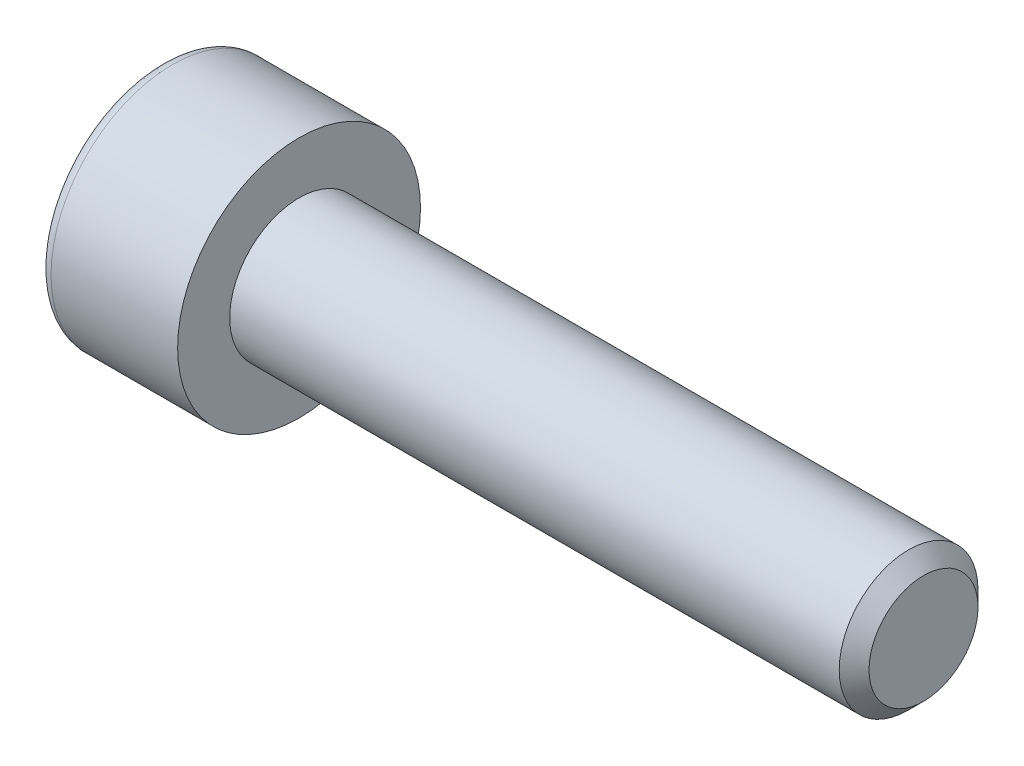
ISO-10303-21;
HEADER;
FILE_DESCRIPTION(('STEP AP214'),'2;1');
FILE_NAME('part.step','',(''),(''),'','','');
FILE_SCHEMA(('AUTOMOTIVE_DESIGN { 1 0 10303 214 1 1 1 1 }'));
ENDSEC;
DATA;
#1=APPLICATION_CONTEXT('core data for automotive mechanical design processes');
#2=APPLICATION_PROTOCOL_DEFINITION('international standard','automotive_design',2000,#1);
#3=PRODUCT_CONTEXT('',#1,'mechanical');
#4=PRODUCT('Part','Part','',(#3));
#5=PRODUCT_RELATED_PRODUCT_CATEGORY('part','',(#4));
#6=PRODUCT_DEFINITION_FORMATION('','',#4);
#7=PRODUCT_DEFINITION_CONTEXT('part definition',#1,'design');
#8=PRODUCT_DEFINITION('design','',#6,#7);
#9=PRODUCT_DEFINITION_SHAPE('','',#8);
#10=(LENGTH_UNIT() NAMED_UNIT(*) SI_UNIT(.MILLI.,.METRE.));
#11=(NAMED_UNIT(*) PLANE_ANGLE_UNIT() SI_UNIT($,.RADIAN.));
#12=(NAMED_UNIT(*) SI_UNIT($,.STERADIAN.) SOLID_ANGLE_UNIT());
#13=UNCERTAINTY_MEASURE_WITH_UNIT(LENGTH_MEASURE(1.E-05),#10,'distance_accuracy_value','');
#14=(GEOMETRIC_REPRESENTATION_CONTEXT(3) GLOBAL_UNCERTAINTY_ASSIGNED_CONTEXT((#13)) GLOBAL_UNIT_ASSIGNED_CONTEXT((#10,
#11,#12)) REPRESENTATION_CONTEXT('',''));
#15=CARTESIAN_POINT('',(0.,0.,0.));
#16=DIRECTION('',(0.,0.,1.));
#17=DIRECTION('',(1.,0.,0.));
#18=AXIS2_PLACEMENT_3D('',#15,#16,#17);
#19=CARTESIAN_POINT('',(18.,-1.60191,1.5705));
#20=DIRECTION('',(1.,0.,0.));
#21=DIRECTION('',(0.,0.,-1.));
#22=AXIS2_PLACEMENT_3D('',#19,#20,#21);
#23=PLANE('',#22);
#24=CARTESIAN_POINT('',(18.,0.,0.));
#25=DIRECTION('',(-1.,0.,0.));
#26=DIRECTION('',(0.,0.,1.));
#27=AXIS2_PLACEMENT_3D('',#24,#25,#26);
#28=CIRCLE('',#27,1.5705);
#29=CARTESIAN_POINT('',(18.,0.,1.5705));
#30=VERTEX_POINT('',#29);
#31=EDGE_CURVE('E20',#30,#30,#28,.T.);
#32=ORIENTED_EDGE('',*,*,#31,.F.);
#33=EDGE_LOOP('',(#32));
#34=FACE_BOUND('',#33,.T.);
#35=ADVANCED_FACE('F16',(#34),#23,.T.);
#36=CARTESIAN_POINT('',(-4.,0.,1.7320508075689));
#37=DIRECTION('',(0.,0.500000000000009,-0.866025403784433));
#38=DIRECTION('',(1.,0.,0.));
#39=AXIS2_PLACEMENT_3D('',#36,#37,#38);
#40=PLANE('',#39);
#41=DIRECTION('',(0.,0.866025403784433,0.500000000000009));
#42=VECTOR('',#41,1.);
#43=CARTESIAN_POINT('',(-4.,-0.749999999999999,1.29903810567667));
#44=LINE('',#43,#42);
#45=CARTESIAN_POINT('',(-4.,-1.5,0.86602540378444));
#46=VERTEX_POINT('',#45);
#47=CARTESIAN_POINT('',(-4.,0.,1.7320508075689));
#48=VERTEX_POINT('',#47);
#49=EDGE_CURVE('E68',#46,#48,#44,.T.);
#50=ORIENTED_EDGE('',*,*,#49,.T.);
#51=DIRECTION('',(-1.,0.,0.));
#52=VECTOR('',#51,1.);
#53=CARTESIAN_POINT('',(-2.675,0.,1.7320508075689));
#54=LINE('',#53,#52);
#55=CARTESIAN_POINT('',(-1.6,0.,1.7320508075689));
#56=VERTEX_POINT('',#55);
#57=EDGE_CURVE('E77',#56,#48,#54,.T.);
#58=ORIENTED_EDGE('',*,*,#57,.F.);
#59=CARTESIAN_POINT('',(-1.59999999999999,-1.50000000000001,0.866025403784436));
#60=CARTESIAN_POINT('',(-1.57802165884498,-1.43408408432772,0.90408197544171));
#61=CARTESIAN_POINT('',(-1.55803350782515,-1.3675991834091,0.942467050884126));
#62=CARTESIAN_POINT('',(-1.52314479055019,-1.23347823998543,1.01990181367375));
#63=CARTESIAN_POINT('',(-1.50825656525356,-1.16583981518653,1.05895287643896));
#64=CARTESIAN_POINT('',(-1.48508196920955,-1.03140117468085,1.1365710617244));
#65=CARTESIAN_POINT('',(-1.47664134069767,-0.964621638287686,1.17512624503735));
#66=CARTESIAN_POINT('',(-1.46656687609782,-0.830748509653515,1.25241793189155));
#67=CARTESIAN_POINT('',(-1.46492469548064,-0.763655403671048,1.2911541546913));
#68=CARTESIAN_POINT('',(-1.46834971761608,-0.638299132717716,1.36352863147081));
#69=CARTESIAN_POINT('',(-1.47257596391218,-0.580017157017145,1.39717774583044));
#70=CARTESIAN_POINT('',(-1.4859679755386,-0.463832893676476,1.46425676154578));
#71=CARTESIAN_POINT('',(-1.49513831107649,-0.405931007586783,1.49768643106625));
#72=CARTESIAN_POINT('',(-1.51806237500374,-0.289507393706606,1.56490363588));
#73=CARTESIAN_POINT('',(-1.53191323166373,-0.231000393462347,1.5986826682205));
#74=CARTESIAN_POINT('',(-1.56334882062951,-0.114858772496334,1.66573706434935));
#75=CARTESIAN_POINT('',(-1.58092617156416,-0.0572226650139558,1.69901328651934));
#76=CARTESIAN_POINT('',(-1.6,0.,1.7320508075689));
#77=B_SPLINE_CURVE_WITH_KNOTS('',3,(#59,#60,#61,#62,#63,#64,#65,#66,#67,#68,#69,#70,#71,#72,#73,
#74,#75,#76),.UNSPECIFIED.,.F.,.F.,(4,2,2,2,2,2,2,2,4),(0.,0.237762008667641,0.476095362770332,
0.708530704614692,0.940680666673367,1.14278083697393,1.34506814534581,1.55184121686651,
1.75820848013624),.UNSPECIFIED.);
#78=CARTESIAN_POINT('',(-1.59999999999999,-1.5,0.866025403784442));
#79=VERTEX_POINT('',#78);
#80=EDGE_CURVE('E63',#79,#56,#77,.T.);
#81=ORIENTED_EDGE('',*,*,#80,.F.);
#82=DIRECTION('',(1.,0.,0.));
#83=VECTOR('',#82,1.);
#84=CARTESIAN_POINT('',(-2.675,-1.5,0.86602540378444));
#85=LINE('',#84,#83);
#86=EDGE_CURVE('E99',#46,#79,#85,.T.);
#87=ORIENTED_EDGE('',*,*,#86,.F.);
#88=EDGE_LOOP('',(#50,#58,#81,#87));
#89=FACE_BOUND('',#88,.T.);
#90=ADVANCED_FACE('F78',(#89),#40,.T.);
#91=CARTESIAN_POINT('',(18.,0.,0.));
#92=DIRECTION('',(-1.,0.,0.));
#93=DIRECTION('',(0.,0.,1.));
#94=AXIS2_PLACEMENT_3D('',#91,#92,#93);
#95=CONICAL_SURFACE('',#94,1.5705,0.785398163397445);
#96=ORIENTED_EDGE('',*,*,#31,.T.);
#97=EDGE_LOOP('',(#96));
#98=FACE_BOUND('',#97,.T.);
#99=CARTESIAN_POINT('',(17.5705,0.,0.));
#100=DIRECTION('',(-1.,0.,0.));
#101=DIRECTION('',(0.,0.,1.));
#102=AXIS2_PLACEMENT_3D('',#99,#100,#101);
#103=CIRCLE('',#102,2.);
#104=CARTESIAN_POINT('',(17.5705,0.,2.));
#105=VERTEX_POINT('',#104);
#106=EDGE_CURVE('E95',#105,#105,#103,.T.);
#107=ORIENTED_EDGE('',*,*,#106,.F.);
#108=EDGE_LOOP('',(#107));
#109=FACE_BOUND('',#108,.T.);
#110=ADVANCED_FACE('F232',(#98,#109),#95,.T.);
#111=CARTESIAN_POINT('',(-4.,1.5,0.86602540378444));
#112=DIRECTION('',(0.,-0.500000000000009,-0.866025403784433));
#113=DIRECTION('',(1.,0.,0.));
#114=AXIS2_PLACEMENT_3D('',#111,#112,#113);
#115=PLANE('',#114);
#116=DIRECTION('',(0.,0.866025403784433,-0.500000000000009));
#117=VECTOR('',#116,1.);
#118=CARTESIAN_POINT('',(-4.,0.75,1.29903810567667));
#119=LINE('',#118,#117);
#120=CARTESIAN_POINT('',(-4.,1.5,0.86602540378444));
#121=VERTEX_POINT('',#120);
#122=EDGE_CURVE('E81',#48,#121,#119,.T.);
#123=ORIENTED_EDGE('',*,*,#122,.T.);
#124=DIRECTION('',(-1.,0.,0.));
#125=VECTOR('',#124,1.);
#126=CARTESIAN_POINT('',(-2.675,1.5,0.86602540378444));
#127=LINE('',#126,#125);
#128=CARTESIAN_POINT('',(-1.59999999999999,1.5,0.866025403784438));
#129=VERTEX_POINT('',#128);
#130=EDGE_CURVE('E92',#129,#121,#127,.T.);
#131=ORIENTED_EDGE('',*,*,#130,.F.);
#132=CARTESIAN_POINT('',(-1.6,0.,1.7320508075689));
#133=CARTESIAN_POINT('',(-1.57802165884499,0.0659159156722827,1.69399423591163));
#134=CARTESIAN_POINT('',(-1.55803350782516,0.132400816590911,1.65560916046921));
#135=CARTESIAN_POINT('',(-1.52314479055019,0.266521760014577,1.57817439767959));
#136=CARTESIAN_POINT('',(-1.50825656525356,0.334160184813478,1.53912333491438));
#137=CARTESIAN_POINT('',(-1.48508196920956,0.468598825319165,1.46150514962893));
#138=CARTESIAN_POINT('',(-1.47664134069767,0.535378361712325,1.42294996631598));
#139=CARTESIAN_POINT('',(-1.46656687609782,0.669251490346498,1.34565827946178));
#140=CARTESIAN_POINT('',(-1.46492469548064,0.736344596328965,1.30692205666204));
#141=CARTESIAN_POINT('',(-1.46834971761607,0.861700867282297,1.23454757988252));
#142=CARTESIAN_POINT('',(-1.47257596391217,0.919982842982867,1.20089846552289));
#143=CARTESIAN_POINT('',(-1.4859679755386,1.03616710632354,1.13381944980756));
#144=CARTESIAN_POINT('',(-1.49513831107648,1.09406899241323,1.10038978028709));
#145=CARTESIAN_POINT('',(-1.51806237500374,1.2104926062934,1.03317257547333));
#146=CARTESIAN_POINT('',(-1.53191323166372,1.26899960653766,0.999393543132834));
#147=CARTESIAN_POINT('',(-1.5633488206295,1.38514122750367,0.932339147003986));
#148=CARTESIAN_POINT('',(-1.58092617156415,1.44277733498605,0.899062924833992));
#149=CARTESIAN_POINT('',(-1.59999999999999,1.50000000000001,0.866025403784436));
#150=B_SPLINE_CURVE_WITH_KNOTS('',3,(#132,#133,#134,#135,#136,#137,#138,#139,#140,#141,#142,
#143,#144,#145,#146,#147,#148,#149),.UNSPECIFIED.,.F.,.F.,(4,2,2,2,2,2,2,2,4),(0.,
0.237762008667644,0.476095362770338,0.7085307046147,0.940680666673377,1.14278083697393,
1.34506814534582,1.55184121686652,1.75820848013624),.UNSPECIFIED.);
#151=EDGE_CURVE('E85',#56,#129,#150,.T.);
#152=ORIENTED_EDGE('',*,*,#151,.F.);
#153=ORIENTED_EDGE('',*,*,#57,.T.);
#154=EDGE_LOOP('',(#123,#131,#152,#153));
#155=FACE_BOUND('',#154,.T.);
#156=ADVANCED_FACE('F90',(#155),#115,.T.);
#157=CARTESIAN_POINT('',(-4.,-1.5,0.86602540378444));
#158=DIRECTION('',(0.,1.,0.));
#159=DIRECTION('',(1.,0.,0.));
#160=AXIS2_PLACEMENT_3D('',#157,#158,#159);
#161=PLANE('',#160);
#162=DIRECTION('',(0.,0.,1.));
#163=VECTOR('',#162,1.);
#164=CARTESIAN_POINT('',(-4.,-1.5,0.));
#165=LINE('',#164,#163);
#166=CARTESIAN_POINT('',(-4.,-1.5,-0.86602540378444));
#167=VERTEX_POINT('',#166);
#168=EDGE_CURVE('E201',#167,#46,#165,.T.);
#169=ORIENTED_EDGE('',*,*,#168,.T.);
#170=ORIENTED_EDGE('',*,*,#86,.T.);
#171=CARTESIAN_POINT('',(-1.59999999999999,-1.5,0.866025403784448));
#172=CARTESIAN_POINT('',(-1.57802165884498,-1.5,0.789912260469902));
#173=CARTESIAN_POINT('',(-1.55803350782515,-1.5,0.713142109585072));
#174=CARTESIAN_POINT('',(-1.52314479055019,-1.5,0.558272584005832));
#175=CARTESIAN_POINT('',(-1.50825656525356,-1.5,0.480170458475417));
#176=CARTESIAN_POINT('',(-1.48508196920955,-1.5,0.324934087904525));
#177=CARTESIAN_POINT('',(-1.47664134069766,-1.5,0.247823721278626));
#178=CARTESIAN_POINT('',(-1.46656687609782,-1.5,0.0932403475702334));
#179=CARTESIAN_POINT('',(-1.46492469548063,-1.5,0.015767901970742));
#180=CARTESIAN_POINT('',(-1.46834971761607,-1.5,-0.128981051588286));
#181=CARTESIAN_POINT('',(-1.47257596391217,-1.5,-0.196279280307542));
#182=CARTESIAN_POINT('',(-1.4859679755386,-1.5,-0.330437311738211));
#183=CARTESIAN_POINT('',(-1.49513831107648,-1.5,-0.397296650779154));
#184=CARTESIAN_POINT('',(-1.51806237500373,-1.5,-0.531731060406653));
#185=CARTESIAN_POINT('',(-1.53191323166372,-1.5,-0.599289125087655));
#186=CARTESIAN_POINT('',(-1.5633488206295,-1.5,-0.73339791734535));
#187=CARTESIAN_POINT('',(-1.58092617156415,-1.5,-0.799950361685337));
#188=CARTESIAN_POINT('',(-1.59999999999999,-1.5,-0.866025403784448));
#189=B_SPLINE_CURVE_WITH_KNOTS('',3,(#171,#172,#173,#174,#175,#176,#177,#178,#179,#180,#181,
#182,#183,#184,#185,#186,#187,#188),.UNSPECIFIED.,.F.,.F.,(4,2,2,2,2,2,2,2,4),(0.,
0.237762008667641,0.476095362770333,0.708530704614693,0.940680666673367,1.14278083697393,
1.34506814534581,1.55184121686651,1.75820848013624),.UNSPECIFIED.);
#190=CARTESIAN_POINT('',(-1.59999999999999,-1.5,-0.866025403784442));
#191=VERTEX_POINT('',#190);
#192=EDGE_CURVE('E88',#79,#191,#189,.T.);
#193=ORIENTED_EDGE('',*,*,#192,.T.);
#194=DIRECTION('',(1.,0.,0.));
#195=VECTOR('',#194,1.);
#196=CARTESIAN_POINT('',(-2.675,-1.5,-0.86602540378444));
#197=LINE('',#196,#195);
#198=EDGE_CURVE('E186',#167,#191,#197,.T.);
#199=ORIENTED_EDGE('',*,*,#198,.F.);
#200=EDGE_LOOP('',(#169,#170,#193,#199));
#201=FACE_BOUND('',#200,.T.);
#202=ADVANCED_FACE('F229',(#201),#161,.T.);
#203=CARTESIAN_POINT('',(0.,0.,0.));
#204=DIRECTION('',(1.,0.,0.));
#205=DIRECTION('',(0.,0.,-1.));
#206=AXIS2_PLACEMENT_3D('',#203,#204,#205);
#207=CYLINDRICAL_SURFACE('',#206,2.);
#208=CARTESIAN_POINT('',(0.,0.,0.));
#209=DIRECTION('',(1.,0.,0.));
#210=DIRECTION('',(0.,0.,-1.));
#211=AXIS2_PLACEMENT_3D('',#208,#209,#210);
#212=CIRCLE('',#211,2.);
#213=CARTESIAN_POINT('',(0.,0.,-2.));
#214=VERTEX_POINT('',#213);
#215=EDGE_CURVE('E148',#214,#214,#212,.F.);
#216=ORIENTED_EDGE('',*,*,#215,.F.);
#217=EDGE_LOOP('',(#216));
#218=FACE_BOUND('',#217,.T.);
#219=ORIENTED_EDGE('',*,*,#106,.T.);
#220=EDGE_LOOP('',(#219));
#221=FACE_BOUND('',#220,.T.);
#222=ADVANCED_FACE('F122',(#218,#221),#207,.T.);
#223=CARTESIAN_POINT('',(-1.6,0.,0.));
#224=DIRECTION('',(-1.,0.,0.));
#225=DIRECTION('',(0.,0.,1.));
#226=AXIS2_PLACEMENT_3D('',#223,#224,#225);
#227=CONICAL_SURFACE('',#226,1.7320508075689,1.0471975511966);
#228=ORIENTED_EDGE('',*,*,#80,.T.);
#229=ORIENTED_EDGE('',*,*,#151,.T.);
#230=CARTESIAN_POINT('',(-1.59999999999999,1.5,-0.866025403784448));
#231=CARTESIAN_POINT('',(-1.57802165884498,1.5,-0.789912260469902));
#232=CARTESIAN_POINT('',(-1.55803350782515,1.5,-0.713142109585071));
#233=CARTESIAN_POINT('',(-1.52314479055019,1.5,-0.558272584005831));
#234=CARTESIAN_POINT('',(-1.50825656525356,1.5,-0.480170458475416));
#235=CARTESIAN_POINT('',(-1.48508196920955,1.5,-0.324934087904525));
#236=CARTESIAN_POINT('',(-1.47664134069766,1.5,-0.247823721278626));
#237=CARTESIAN_POINT('',(-1.46656687609782,1.5,-0.0932403475702334));
#238=CARTESIAN_POINT('',(-1.46492469548063,1.5,-0.015767901970742));
#239=CARTESIAN_POINT('',(-1.46834971761607,1.5,0.128981051588286));
#240=CARTESIAN_POINT('',(-1.47257596391217,1.5,0.196279280307542));
#241=CARTESIAN_POINT('',(-1.4859679755386,1.5,0.330437311738211));
#242=CARTESIAN_POINT('',(-1.49513831107648,1.5,0.397296650779153));
#243=CARTESIAN_POINT('',(-1.51806237500373,1.5,0.531731060406653));
#244=CARTESIAN_POINT('',(-1.53191323166372,1.5,0.599289125087655));
#245=CARTESIAN_POINT('',(-1.5633488206295,1.5,0.733397917345349));
#246=CARTESIAN_POINT('',(-1.58092617156415,1.5,0.799950361685337));
#247=CARTESIAN_POINT('',(-1.59999999999999,1.5,0.866025403784447));
#248=B_SPLINE_CURVE_WITH_KNOTS('',3,(#230,#231,#232,#233,#234,#235,#236,#237,#238,#239,#240,
#241,#242,#243,#244,#245,#246,#247),.UNSPECIFIED.,.F.,.F.,(4,2,2,2,2,2,2,2,4),(0.,
0.237762008667641,0.476095362770332,0.708530704614692,0.940680666673367,1.14278083697393,
1.34506814534581,1.55184121686651,1.75820848013624),.UNSPECIFIED.);
#249=CARTESIAN_POINT('',(-1.59999999999999,1.5,-0.866025403784444));
#250=VERTEX_POINT('',#249);
#251=EDGE_CURVE('E94',#250,#129,#248,.T.);
#252=ORIENTED_EDGE('',*,*,#251,.F.);
#253=CARTESIAN_POINT('',(-1.6,0.,-1.7320508075689));
#254=CARTESIAN_POINT('',(-1.57802165884499,0.0659159156722819,-1.69399423591163));
#255=CARTESIAN_POINT('',(-1.55803350782516,0.13240081659091,-1.65560916046921));
#256=CARTESIAN_POINT('',(-1.52314479055019,0.266521760014576,-1.57817439767959));
#257=CARTESIAN_POINT('',(-1.50825656525356,0.334160184813477,-1.53912333491438));
#258=CARTESIAN_POINT('',(-1.48508196920956,0.468598825319164,-1.46150514962893));
#259=CARTESIAN_POINT('',(-1.47664134069767,0.535378361712325,-1.42294996631598));
#260=CARTESIAN_POINT('',(-1.46656687609782,0.669251490346497,-1.34565827946178));
#261=CARTESIAN_POINT('',(-1.46492469548064,0.736344596328965,-1.30692205666204));
#262=CARTESIAN_POINT('',(-1.46834971761607,0.861700867282296,-1.23454757988252));
#263=CARTESIAN_POINT('',(-1.47257596391217,0.919982842982866,-1.20089846552289));
#264=CARTESIAN_POINT('',(-1.4859679755386,1.03616710632353,-1.13381944980756));
#265=CARTESIAN_POINT('',(-1.49513831107648,1.09406899241323,-1.10038978028709));
#266=CARTESIAN_POINT('',(-1.51806237500374,1.2104926062934,-1.03317257547334));
#267=CARTESIAN_POINT('',(-1.53191323166372,1.26899960653766,-0.999393543132834));
#268=CARTESIAN_POINT('',(-1.5633488206295,1.38514122750367,-0.932339147003986));
#269=CARTESIAN_POINT('',(-1.58092617156415,1.44277733498605,-0.899062924833993));
#270=CARTESIAN_POINT('',(-1.59999999999999,1.50000000000001,-0.866025403784437));
#271=B_SPLINE_CURVE_WITH_KNOTS('',3,(#253,#254,#255,#256,#257,#258,#259,#260,#261,#262,#263,
#264,#265,#266,#267,#268,#269,#270),.UNSPECIFIED.,.F.,.F.,(4,2,2,2,2,2,2,2,4),(0.,
0.237762008667644,0.476095362770337,0.7085307046147,0.940680666673376,1.14278083697393,
1.34506814534582,1.55184121686652,1.75820848013624),.UNSPECIFIED.);
#272=CARTESIAN_POINT('',(-1.6,0.,-1.7320508075689));
#273=VERTEX_POINT('',#272);
#274=EDGE_CURVE('E128',#273,#250,#271,.T.);
#275=ORIENTED_EDGE('',*,*,#274,.F.);
#276=CARTESIAN_POINT('',(-1.59999999999999,-1.50000000000001,-0.866025403784436));
#277=CARTESIAN_POINT('',(-1.57802165884498,-1.43408408432772,-0.90408197544171));
#278=CARTESIAN_POINT('',(-1.55803350782515,-1.3675991834091,-0.942467050884126));
#279=CARTESIAN_POINT('',(-1.52314479055019,-1.23347823998543,-1.01990181367375));
#280=CARTESIAN_POINT('',(-1.50825656525356,-1.16583981518653,-1.05895287643896));
#281=CARTESIAN_POINT('',(-1.48508196920955,-1.03140117468085,-1.1365710617244));
#282=CARTESIAN_POINT('',(-1.47664134069767,-0.964621638287686,-1.17512624503735));
#283=CARTESIAN_POINT('',(-1.46656687609782,-0.830748509653515,-1.25241793189155));
#284=CARTESIAN_POINT('',(-1.46492469548064,-0.763655403671048,-1.2911541546913));
#285=CARTESIAN_POINT('',(-1.46834971761608,-0.638299132717716,-1.36352863147081));
#286=CARTESIAN_POINT('',(-1.47257596391218,-0.580017157017145,-1.39717774583044));
#287=CARTESIAN_POINT('',(-1.4859679755386,-0.463832893676476,-1.46425676154578));
#288=CARTESIAN_POINT('',(-1.49513831107649,-0.405931007586783,-1.49768643106625));
#289=CARTESIAN_POINT('',(-1.51806237500374,-0.289507393706607,-1.56490363588));
#290=CARTESIAN_POINT('',(-1.53191323166373,-0.231000393462347,-1.5986826682205));
#291=CARTESIAN_POINT('',(-1.56334882062951,-0.114858772496335,-1.66573706434935));
#292=CARTESIAN_POINT('',(-1.58092617156416,-0.0572226650139561,-1.69901328651934));
#293=CARTESIAN_POINT('',(-1.6,0.,-1.7320508075689));
#294=B_SPLINE_CURVE_WITH_KNOTS('',3,(#276,#277,#278,#279,#280,#281,#282,#283,#284,#285,#286,
#287,#288,#289,#290,#291,#292,#293),.UNSPECIFIED.,.F.,.F.,(4,2,2,2,2,2,2,2,4),(0.,
0.237762008667642,0.476095362770332,0.708530704614693,0.940680666673367,1.14278083697393,
1.34506814534581,1.55184121686651,1.75820848013624),.UNSPECIFIED.);
#295=EDGE_CURVE('E142',#191,#273,#294,.T.);
#296=ORIENTED_EDGE('',*,*,#295,.F.);
#297=ORIENTED_EDGE('',*,*,#192,.F.);
#298=EDGE_LOOP('',(#228,#229,#252,#275,#296,#297));
#299=FACE_BOUND('',#298,.T.);
#300=CARTESIAN_POINT('',(-0.6,0.,0.));
#301=VERTEX_POINT('',#300);
#302=VERTEX_LOOP('',#301);
#303=FACE_BOUND('',#302,.T.);
#304=ADVANCED_FACE('F84',(#299,#303),#227,.F.);
#305=CARTESIAN_POINT('',(-4.,1.5,-0.86602540378444));
#306=DIRECTION('',(0.,-1.,0.));
#307=DIRECTION('',(1.,0.,0.));
#308=AXIS2_PLACEMENT_3D('',#305,#306,#307);
#309=PLANE('',#308);
#310=DIRECTION('',(0.,0.,-1.));
#311=VECTOR('',#310,1.);
#312=CARTESIAN_POINT('',(-4.,1.5,0.));
#313=LINE('',#312,#311);
#314=CARTESIAN_POINT('',(-3.999999999975,1.5,-0.86602540378444));
#315=VERTEX_POINT('',#314);
#316=EDGE_CURVE('E147',#121,#315,#313,.T.);
#317=ORIENTED_EDGE('',*,*,#316,.T.);
#318=DIRECTION('',(-1.,0.,0.));
#319=VECTOR('',#318,1.);
#320=CARTESIAN_POINT('',(-2.675,1.5,-0.86602540378444));
#321=LINE('',#320,#319);
#322=EDGE_CURVE('E184',#250,#315,#321,.T.);
#323=ORIENTED_EDGE('',*,*,#322,.F.);
#324=ORIENTED_EDGE('',*,*,#251,.T.);
#325=ORIENTED_EDGE('',*,*,#130,.T.);
#326=EDGE_LOOP('',(#317,#323,#324,#325));
#327=FACE_BOUND('',#326,.T.);
#328=ADVANCED_FACE('F121',(#327),#309,.T.);
#329=CARTESIAN_POINT('',(-4.,-1.5,-0.86602540378444));
#330=DIRECTION('',(0.,0.500000000000009,0.866025403784433));
#331=DIRECTION('',(1.,0.,0.));
#332=AXIS2_PLACEMENT_3D('',#329,#330,#331);
#333=PLANE('',#332);
#334=DIRECTION('',(0.,-0.866025403784433,0.500000000000009));
#335=VECTOR('',#334,1.);
#336=CARTESIAN_POINT('',(-4.,-0.75,-1.29903810567667));
#337=LINE('',#336,#335);
#338=CARTESIAN_POINT('',(-3.999999999975,0.,-1.7320508075689));
#339=VERTEX_POINT('',#338);
#340=EDGE_CURVE('E35',#339,#167,#337,.T.);
#341=ORIENTED_EDGE('',*,*,#340,.T.);
#342=ORIENTED_EDGE('',*,*,#198,.T.);
#343=ORIENTED_EDGE('',*,*,#295,.T.);
#344=DIRECTION('',(1.,0.,0.));
#345=VECTOR('',#344,1.);
#346=CARTESIAN_POINT('',(-2.675,0.,-1.7320508075689));
#347=LINE('',#346,#345);
#348=EDGE_CURVE('E216',#339,#273,#347,.T.);
#349=ORIENTED_EDGE('',*,*,#348,.F.);
#350=EDGE_LOOP('',(#341,#342,#343,#349));
#351=FACE_BOUND('',#350,.T.);
#352=ADVANCED_FACE('F149',(#351),#333,.T.);
#353=CARTESIAN_POINT('',(0.,-3.57,3.5));
#354=DIRECTION('',(1.,0.,0.));
#355=DIRECTION('',(0.,0.,-1.));
#356=AXIS2_PLACEMENT_3D('',#353,#354,#355);
#357=PLANE('',#356);
#358=CARTESIAN_POINT('',(0.,0.,0.));
#359=DIRECTION('',(1.,0.,0.));
#360=DIRECTION('',(0.,0.,-1.));
#361=AXIS2_PLACEMENT_3D('',#358,#359,#360);
#362=CIRCLE('',#361,3.5);
#363=CARTESIAN_POINT('',(0.,0.,-3.5));
#364=VERTEX_POINT('',#363);
#365=EDGE_CURVE('E180',#364,#364,#362,.F.);
#366=ORIENTED_EDGE('',*,*,#365,.F.);
#367=EDGE_LOOP('',(#366));
#368=FACE_BOUND('',#367,.T.);
#369=ORIENTED_EDGE('',*,*,#215,.T.);
#370=EDGE_LOOP('',(#369));
#371=FACE_BOUND('',#370,.T.);
#372=ADVANCED_FACE('F153',(#368,#371),#357,.T.);
#373=CARTESIAN_POINT('',(-4.,0.,-1.7320508075689));
#374=DIRECTION('',(0.,-0.500000000000009,0.866025403784433));
#375=DIRECTION('',(1.,0.,0.));
#376=AXIS2_PLACEMENT_3D('',#373,#374,#375);
#377=PLANE('',#376);
#378=DIRECTION('',(0.,0.866025403784433,0.500000000000009));
#379=VECTOR('',#378,1.);
#380=CARTESIAN_POINT('',(-3.99999999995,0.,-1.7320508075689));
#381=LINE('',#380,#379);
#382=EDGE_CURVE('E178',#339,#315,#381,.T.);
#383=ORIENTED_EDGE('',*,*,#382,.F.);
#384=ORIENTED_EDGE('',*,*,#348,.T.);
#385=ORIENTED_EDGE('',*,*,#274,.T.);
#386=ORIENTED_EDGE('',*,*,#322,.T.);
#387=EDGE_LOOP('',(#383,#384,#385,#386));
#388=FACE_BOUND('',#387,.T.);
#389=ADVANCED_FACE('F156',(#388),#377,.T.);
#390=CARTESIAN_POINT('',(-3.65,0.,0.));
#391=DIRECTION('',(1.,0.,0.));
#392=DIRECTION('',(0.,0.,-1.));
#393=AXIS2_PLACEMENT_3D('',#390,#391,#392);
#394=CYLINDRICAL_SURFACE('',#393,3.5);
#395=ORIENTED_EDGE('',*,*,#365,.T.);
#396=EDGE_LOOP('',(#395));
#397=FACE_BOUND('',#396,.T.);
#398=CARTESIAN_POINT('',(-3.65,0.,0.));
#399=DIRECTION('',(-1.,0.,0.));
#400=DIRECTION('',(0.,0.,1.));
#401=AXIS2_PLACEMENT_3D('',#398,#399,#400);
#402=CIRCLE('',#401,3.4999999999);
#403=CARTESIAN_POINT('',(-3.65,0.,3.4999999999));
#404=VERTEX_POINT('',#403);
#405=EDGE_CURVE('E26',#404,#404,#402,.T.);
#406=ORIENTED_EDGE('',*,*,#405,.F.);
#407=EDGE_LOOP('',(#406));
#408=FACE_BOUND('',#407,.T.);
#409=ADVANCED_FACE('F161',(#397,#408),#394,.T.);
#410=CARTESIAN_POINT('',(-3.99999999995,-3.213,-3.15));
#411=DIRECTION('',(-1.,0.,0.));
#412=DIRECTION('',(0.,0.,1.));
#413=AXIS2_PLACEMENT_3D('',#410,#411,#412);
#414=PLANE('',#413);
#415=ORIENTED_EDGE('',*,*,#340,.F.);
#416=ORIENTED_EDGE('',*,*,#382,.T.);
#417=ORIENTED_EDGE('',*,*,#316,.F.);
#418=ORIENTED_EDGE('',*,*,#122,.F.);
#419=ORIENTED_EDGE('',*,*,#49,.F.);
#420=ORIENTED_EDGE('',*,*,#168,.F.);
#421=EDGE_LOOP('',(#415,#416,#417,#418,#419,#420));
#422=FACE_BOUND('',#421,.T.);
#423=CARTESIAN_POINT('',(-3.9999999999,0.,0.));
#424=DIRECTION('',(1.,0.,0.));
#425=DIRECTION('',(0.,0.,-1.));
#426=AXIS2_PLACEMENT_3D('',#423,#424,#425);
#427=CIRCLE('',#426,3.14999999994904);
#428=CARTESIAN_POINT('',(-3.9999999999,0.,-3.14999999994904));
#429=VERTEX_POINT('',#428);
#430=EDGE_CURVE('E10',#429,#429,#427,.T.);
#431=ORIENTED_EDGE('',*,*,#430,.F.);
#432=EDGE_LOOP('',(#431));
#433=FACE_BOUND('',#432,.T.);
#434=ADVANCED_FACE('F164',(#422,#433),#414,.T.);
#435=CARTESIAN_POINT('',(-3.6499999999,0.,0.));
#436=DIRECTION('',(1.,0.,0.));
#437=DIRECTION('',(0.,0.,-1.));
#438=AXIS2_PLACEMENT_3D('',#435,#436,#437);
#439=TOROIDAL_SURFACE('',#438,3.1499999999,0.349999999999999);
#440=ORIENTED_EDGE('',*,*,#430,.T.);
#441=EDGE_LOOP('',(#440));
#442=FACE_BOUND('',#441,.T.);
#443=ORIENTED_EDGE('',*,*,#405,.T.);
#444=EDGE_LOOP('',(#443));
#445=FACE_BOUND('',#444,.T.);
#446=ADVANCED_FACE('F18',(#442,#445),#439,.T.);
#447=CLOSED_SHELL('',(#35,#90,#110,#156,#202,#222,#304,#328,#352,#372,#389,#409,#434,#446));
#448=MANIFOLD_SOLID_BREP('B1',#447);
#449=ADVANCED_BREP_SHAPE_REPRESENTATION('',(#18,#448),#14);
#450=SHAPE_DEFINITION_REPRESENTATION(#9,#449);
ENDSEC;
END-ISO-10303-21;
